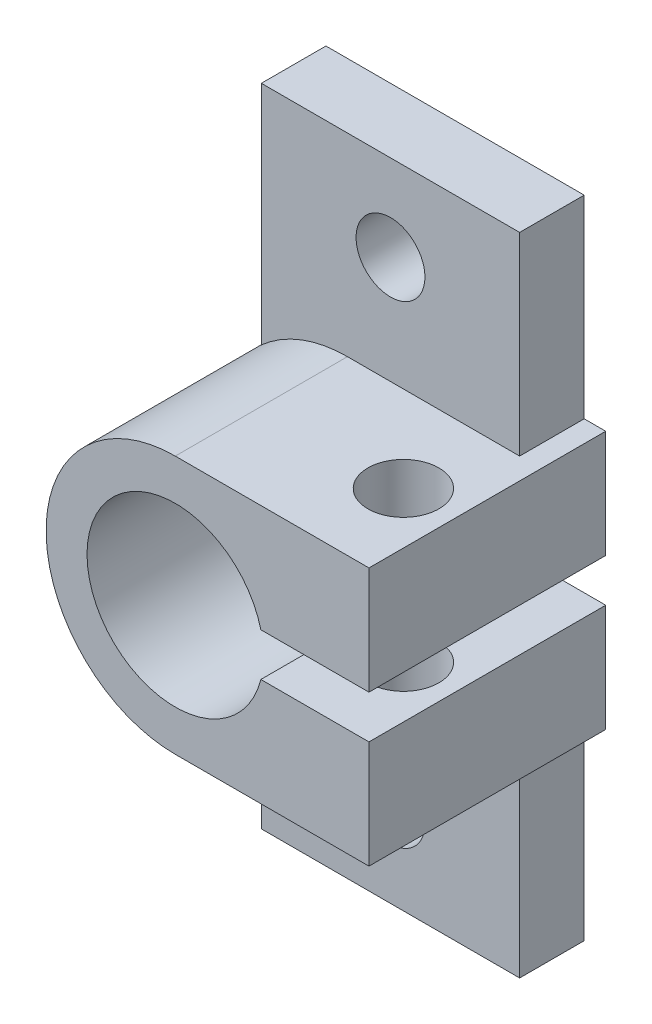
ISO-10303-21;
HEADER;
FILE_DESCRIPTION(('STEP AP214'),'2;1');
FILE_NAME('part.step','',(''),(''),'','','');
FILE_SCHEMA(('AUTOMOTIVE_DESIGN { 1 0 10303 214 1 1 1 1 }'));
ENDSEC;
DATA;
#1=APPLICATION_CONTEXT('core data for automotive mechanical design processes');
#2=APPLICATION_PROTOCOL_DEFINITION('international standard','automotive_design',2000,#1);
#3=PRODUCT_CONTEXT('',#1,'mechanical');
#4=PRODUCT('Part','Part','',(#3));
#5=PRODUCT_RELATED_PRODUCT_CATEGORY('part','',(#4));
#6=PRODUCT_DEFINITION_FORMATION('','',#4);
#7=PRODUCT_DEFINITION_CONTEXT('part definition',#1,'design');
#8=PRODUCT_DEFINITION('design','',#6,#7);
#9=PRODUCT_DEFINITION_SHAPE('','',#8);
#10=(LENGTH_UNIT() NAMED_UNIT(*) SI_UNIT(.MILLI.,.METRE.));
#11=(NAMED_UNIT(*) PLANE_ANGLE_UNIT() SI_UNIT($,.RADIAN.));
#12=(NAMED_UNIT(*) SI_UNIT($,.STERADIAN.) SOLID_ANGLE_UNIT());
#13=UNCERTAINTY_MEASURE_WITH_UNIT(LENGTH_MEASURE(1.E-05),#10,'distance_accuracy_value','');
#14=(GEOMETRIC_REPRESENTATION_CONTEXT(3) GLOBAL_UNCERTAINTY_ASSIGNED_CONTEXT((#13)) GLOBAL_UNIT_ASSIGNED_CONTEXT((#10,
#11,#12)) REPRESENTATION_CONTEXT('',''));
#15=CARTESIAN_POINT('',(0.,0.,0.));
#16=DIRECTION('',(0.,0.,1.));
#17=DIRECTION('',(1.,0.,0.));
#18=AXIS2_PLACEMENT_3D('',#15,#16,#17);
#19=CARTESIAN_POINT('',(0.,0.,0.));
#20=DIRECTION('',(0.,0.,1.));
#21=DIRECTION('',(1.,0.,0.));
#22=AXIS2_PLACEMENT_3D('',#19,#20,#21);
#23=CYLINDRICAL_SURFACE('',#22,6.);
#24=CARTESIAN_POINT('',(0.,0.,3.));
#25=DIRECTION('',(0.,0.,1.));
#26=DIRECTION('',(1.,0.,0.));
#27=AXIS2_PLACEMENT_3D('',#24,#25,#26);
#28=CIRCLE('',#27,6.);
#29=CARTESIAN_POINT('',(-4.,4.47213595499958,3.));
#30=VERTEX_POINT('',#29);
#31=CARTESIAN_POINT('',(0.,6.,3.));
#32=VERTEX_POINT('',#31);
#33=EDGE_CURVE('E47',#30,#32,#28,.F.);
#34=ORIENTED_EDGE('',*,*,#33,.F.);
#35=DIRECTION('',(0.,0.,1.));
#36=VECTOR('',#35,1.);
#37=CARTESIAN_POINT('',(-4.,4.47213595499958,0.));
#38=LINE('',#37,#36);
#39=CARTESIAN_POINT('',(-4.,4.47213595499958,0.));
#40=VERTEX_POINT('',#39);
#41=EDGE_CURVE('E11',#30,#40,#38,.F.);
#42=ORIENTED_EDGE('',*,*,#41,.T.);
#43=CARTESIAN_POINT('',(0.,0.,0.));
#44=DIRECTION('',(0.,0.,1.));
#45=DIRECTION('',(-1.,0.,0.));
#46=AXIS2_PLACEMENT_3D('',#43,#44,#45);
#47=CIRCLE('',#46,6.);
#48=CARTESIAN_POINT('',(-4.,-4.47213595499958,0.));
#49=VERTEX_POINT('',#48);
#50=EDGE_CURVE('E211',#40,#49,#47,.T.);
#51=ORIENTED_EDGE('',*,*,#50,.T.);
#52=DIRECTION('',(0.,0.,1.));
#53=VECTOR('',#52,1.);
#54=CARTESIAN_POINT('',(-4.,-4.47213595499958,0.));
#55=LINE('',#54,#53);
#56=CARTESIAN_POINT('',(-4.,-4.47213595499958,3.));
#57=VERTEX_POINT('',#56);
#58=EDGE_CURVE('E248',#57,#49,#55,.F.);
#59=ORIENTED_EDGE('',*,*,#58,.F.);
#60=CARTESIAN_POINT('',(0.,0.,3.));
#61=DIRECTION('',(0.,0.,1.));
#62=DIRECTION('',(1.,0.,0.));
#63=AXIS2_PLACEMENT_3D('',#60,#61,#62);
#64=CIRCLE('',#63,6.);
#65=CARTESIAN_POINT('',(0.,-6.,3.));
#66=VERTEX_POINT('',#65);
#67=EDGE_CURVE('E245',#57,#66,#64,.T.);
#68=ORIENTED_EDGE('',*,*,#67,.T.);
#69=DIRECTION('',(0.,0.,1.));
#70=VECTOR('',#69,1.);
#71=CARTESIAN_POINT('',(0.,-6.,0.));
#72=LINE('',#71,#70);
#73=CARTESIAN_POINT('',(0.,-6.,11.));
#74=VERTEX_POINT('',#73);
#75=EDGE_CURVE('E225',#66,#74,#72,.T.);
#76=ORIENTED_EDGE('',*,*,#75,.T.);
#77=CARTESIAN_POINT('',(0.,0.,11.));
#78=DIRECTION('',(0.,0.,1.));
#79=DIRECTION('',(-1.,0.,0.));
#80=AXIS2_PLACEMENT_3D('',#77,#78,#79);
#81=CIRCLE('',#80,6.);
#82=CARTESIAN_POINT('',(0.,6.,11.));
#83=VERTEX_POINT('',#82);
#84=EDGE_CURVE('E187',#83,#74,#81,.T.);
#85=ORIENTED_EDGE('',*,*,#84,.F.);
#86=DIRECTION('',(0.,0.,1.));
#87=VECTOR('',#86,1.);
#88=CARTESIAN_POINT('',(0.,6.,0.));
#89=LINE('',#88,#87);
#90=EDGE_CURVE('E226',#32,#83,#89,.T.);
#91=ORIENTED_EDGE('',*,*,#90,.F.);
#92=EDGE_LOOP('',(#34,#42,#51,#59,#68,#76,#85,#91));
#93=FACE_BOUND('',#92,.T.);
#94=ADVANCED_FACE('F32',(#93),#23,.T.);
#95=CARTESIAN_POINT('',(9.,6.,0.));
#96=DIRECTION('',(0.,1.,0.));
#97=DIRECTION('',(-1.,0.,0.));
#98=AXIS2_PLACEMENT_3D('',#95,#96,#97);
#99=PLANE('',#98);
#100=CARTESIAN_POINT('',(6.6,6.,7.));
#101=DIRECTION('',(0.,1.,0.));
#102=DIRECTION('',(-1.,0.,0.));
#103=AXIS2_PLACEMENT_3D('',#100,#101,#102);
#104=CIRCLE('',#103,1.65);
#105=CARTESIAN_POINT('',(4.95,6.,7.));
#106=VERTEX_POINT('',#105);
#107=EDGE_CURVE('E175',#106,#106,#104,.T.);
#108=ORIENTED_EDGE('',*,*,#107,.F.);
#109=EDGE_LOOP('',(#108));
#110=FACE_BOUND('',#109,.T.);
#111=DIRECTION('',(-1.,0.,0.));
#112=VECTOR('',#111,1.);
#113=CARTESIAN_POINT('',(9.,6.,0.));
#114=LINE('',#113,#112);
#115=CARTESIAN_POINT('',(9.,6.,0.));
#116=VERTEX_POINT('',#115);
#117=CARTESIAN_POINT('',(8.,6.,0.));
#118=VERTEX_POINT('',#117);
#119=EDGE_CURVE('E223',#116,#118,#114,.T.);
#120=ORIENTED_EDGE('',*,*,#119,.T.);
#121=DIRECTION('',(0.,0.,1.));
#122=VECTOR('',#121,1.);
#123=CARTESIAN_POINT('',(8.,6.,0.));
#124=LINE('',#123,#122);
#125=CARTESIAN_POINT('',(8.,6.,3.));
#126=VERTEX_POINT('',#125);
#127=EDGE_CURVE('E185',#118,#126,#124,.T.);
#128=ORIENTED_EDGE('',*,*,#127,.T.);
#129=DIRECTION('',(1.,0.,0.));
#130=VECTOR('',#129,1.);
#131=CARTESIAN_POINT('',(9.,6.,3.));
#132=LINE('',#131,#130);
#133=EDGE_CURVE('E150',#32,#126,#132,.T.);
#134=ORIENTED_EDGE('',*,*,#133,.F.);
#135=ORIENTED_EDGE('',*,*,#90,.T.);
#136=DIRECTION('',(-1.,0.,0.));
#137=VECTOR('',#136,1.);
#138=CARTESIAN_POINT('',(9.,6.,11.));
#139=LINE('',#138,#137);
#140=CARTESIAN_POINT('',(9.,6.,11.));
#141=VERTEX_POINT('',#140);
#142=EDGE_CURVE('E208',#141,#83,#139,.T.);
#143=ORIENTED_EDGE('',*,*,#142,.F.);
#144=DIRECTION('',(0.,0.,1.));
#145=VECTOR('',#144,1.);
#146=CARTESIAN_POINT('',(9.,6.,0.));
#147=LINE('',#146,#145);
#148=EDGE_CURVE('E229',#116,#141,#147,.T.);
#149=ORIENTED_EDGE('',*,*,#148,.F.);
#150=EDGE_LOOP('',(#120,#128,#134,#135,#143,#149));
#151=FACE_BOUND('',#150,.T.);
#152=ADVANCED_FACE('F316',(#110,#151),#99,.T.);
#153=CARTESIAN_POINT('',(0.,0.,3.));
#154=DIRECTION('',(0.,0.,-1.));
#155=DIRECTION('',(-1.,0.,0.));
#156=AXIS2_PLACEMENT_3D('',#153,#154,#155);
#157=CYLINDRICAL_SURFACE('',#156,4.1);
#158=DIRECTION('',(0.,0.,-1.));
#159=VECTOR('',#158,1.);
#160=CARTESIAN_POINT('',(3.97617907041421,-1.,3.));
#161=LINE('',#160,#159);
#162=CARTESIAN_POINT('',(3.97617907041421,-1.,11.));
#163=VERTEX_POINT('',#162);
#164=CARTESIAN_POINT('',(3.97617907041421,-1.,0.));
#165=VERTEX_POINT('',#164);
#166=EDGE_CURVE('E263',#163,#165,#161,.T.);
#167=ORIENTED_EDGE('',*,*,#166,.T.);
#168=CARTESIAN_POINT('',(0.,0.,0.));
#169=DIRECTION('',(0.,0.,1.));
#170=DIRECTION('',(1.,0.,0.));
#171=AXIS2_PLACEMENT_3D('',#168,#169,#170);
#172=CIRCLE('',#171,4.1);
#173=CARTESIAN_POINT('',(3.97617907041421,1.,0.));
#174=VERTEX_POINT('',#173);
#175=EDGE_CURVE('E251',#174,#165,#172,.T.);
#176=ORIENTED_EDGE('',*,*,#175,.F.);
#177=DIRECTION('',(0.,0.,1.));
#178=VECTOR('',#177,1.);
#179=CARTESIAN_POINT('',(3.97617907041421,1.,0.));
#180=LINE('',#179,#178);
#181=CARTESIAN_POINT('',(3.97617907041421,1.,11.));
#182=VERTEX_POINT('',#181);
#183=EDGE_CURVE('E233',#174,#182,#180,.T.);
#184=ORIENTED_EDGE('',*,*,#183,.T.);
#185=CARTESIAN_POINT('',(0.,0.,11.));
#186=DIRECTION('',(0.,0.,-1.));
#187=DIRECTION('',(1.,0.,0.));
#188=AXIS2_PLACEMENT_3D('',#185,#186,#187);
#189=CIRCLE('',#188,4.1);
#190=EDGE_CURVE('E199',#163,#182,#189,.T.);
#191=ORIENTED_EDGE('',*,*,#190,.F.);
#192=EDGE_LOOP('',(#167,#176,#184,#191));
#193=FACE_BOUND('',#192,.T.);
#194=ADVANCED_FACE('F34',(#193),#157,.F.);
#195=CARTESIAN_POINT('',(-4.,0.,3.));
#196=DIRECTION('',(1.,0.,0.));
#197=DIRECTION('',(0.,0.,-1.));
#198=AXIS2_PLACEMENT_3D('',#195,#196,#197);
#199=PLANE('',#198);
#200=DIRECTION('',(0.,-1.,0.));
#201=VECTOR('',#200,1.);
#202=CARTESIAN_POINT('',(-4.,0.,3.));
#203=LINE('',#202,#201);
#204=CARTESIAN_POINT('',(-4.,-15.,3.));
#205=VERTEX_POINT('',#204);
#206=EDGE_CURVE('E252',#57,#205,#203,.T.);
#207=ORIENTED_EDGE('',*,*,#206,.F.);
#208=ORIENTED_EDGE('',*,*,#58,.T.);
#209=DIRECTION('',(0.,-1.,0.));
#210=VECTOR('',#209,1.);
#211=CARTESIAN_POINT('',(-4.,0.,0.));
#212=LINE('',#211,#210);
#213=CARTESIAN_POINT('',(-4.,-15.,0.));
#214=VERTEX_POINT('',#213);
#215=EDGE_CURVE('E265',#49,#214,#212,.T.);
#216=ORIENTED_EDGE('',*,*,#215,.T.);
#217=DIRECTION('',(0.,0.,-1.));
#218=VECTOR('',#217,1.);
#219=CARTESIAN_POINT('',(-4.,-15.,3.));
#220=LINE('',#219,#218);
#221=EDGE_CURVE('E41',#205,#214,#220,.T.);
#222=ORIENTED_EDGE('',*,*,#221,.F.);
#223=EDGE_LOOP('',(#207,#208,#216,#222));
#224=FACE_BOUND('',#223,.T.);
#225=ADVANCED_FACE('F309',(#224),#199,.F.);
#226=CARTESIAN_POINT('',(0.,-15.,3.));
#227=DIRECTION('',(0.,-1.,0.));
#228=DIRECTION('',(1.,0.,0.));
#229=AXIS2_PLACEMENT_3D('',#226,#227,#228);
#230=PLANE('',#229);
#231=DIRECTION('',(-1.,0.,0.));
#232=VECTOR('',#231,1.);
#233=CARTESIAN_POINT('',(0.,-15.,0.));
#234=LINE('',#233,#232);
#235=CARTESIAN_POINT('',(8.,-15.,0.));
#236=VERTEX_POINT('',#235);
#237=EDGE_CURVE('E267',#236,#214,#234,.T.);
#238=ORIENTED_EDGE('',*,*,#237,.F.);
#239=DIRECTION('',(0.,0.,-1.));
#240=VECTOR('',#239,1.);
#241=CARTESIAN_POINT('',(8.,-15.,3.));
#242=LINE('',#241,#240);
#243=CARTESIAN_POINT('',(8.,-15.,3.));
#244=VERTEX_POINT('',#243);
#245=EDGE_CURVE('E278',#244,#236,#242,.T.);
#246=ORIENTED_EDGE('',*,*,#245,.F.);
#247=DIRECTION('',(-1.,0.,0.));
#248=VECTOR('',#247,1.);
#249=CARTESIAN_POINT('',(0.,-15.,3.));
#250=LINE('',#249,#248);
#251=EDGE_CURVE('E254',#244,#205,#250,.T.);
#252=ORIENTED_EDGE('',*,*,#251,.T.);
#253=ORIENTED_EDGE('',*,*,#221,.T.);
#254=EDGE_LOOP('',(#238,#246,#252,#253));
#255=FACE_BOUND('',#254,.T.);
#256=ADVANCED_FACE('F284',(#255),#230,.T.);
#257=CARTESIAN_POINT('',(8.,0.,3.));
#258=DIRECTION('',(-1.,0.,0.));
#259=DIRECTION('',(0.,-1.,0.));
#260=AXIS2_PLACEMENT_3D('',#257,#258,#259);
#261=PLANE('',#260);
#262=DIRECTION('',(0.,1.,0.));
#263=VECTOR('',#262,1.);
#264=CARTESIAN_POINT('',(8.,0.,0.));
#265=LINE('',#264,#263);
#266=CARTESIAN_POINT('',(8.,-6.,0.));
#267=VERTEX_POINT('',#266);
#268=EDGE_CURVE('E270',#236,#267,#265,.T.);
#269=ORIENTED_EDGE('',*,*,#268,.T.);
#270=DIRECTION('',(0.,0.,1.));
#271=VECTOR('',#270,1.);
#272=CARTESIAN_POINT('',(8.,-6.,3.));
#273=LINE('',#272,#271);
#274=CARTESIAN_POINT('',(8.,-6.,3.));
#275=VERTEX_POINT('',#274);
#276=EDGE_CURVE('E242',#267,#275,#273,.T.);
#277=ORIENTED_EDGE('',*,*,#276,.T.);
#278=DIRECTION('',(0.,1.,0.));
#279=VECTOR('',#278,1.);
#280=CARTESIAN_POINT('',(8.,0.,3.));
#281=LINE('',#280,#279);
#282=EDGE_CURVE('E258',#244,#275,#281,.T.);
#283=ORIENTED_EDGE('',*,*,#282,.F.);
#284=ORIENTED_EDGE('',*,*,#245,.T.);
#285=EDGE_LOOP('',(#269,#277,#283,#284));
#286=FACE_BOUND('',#285,.T.);
#287=ADVANCED_FACE('F297',(#286),#261,.F.);
#288=CARTESIAN_POINT('',(0.,-1.,3.));
#289=DIRECTION('',(0.,1.,0.));
#290=DIRECTION('',(0.,0.,1.));
#291=AXIS2_PLACEMENT_3D('',#288,#289,#290);
#292=PLANE('',#291);
#293=CARTESIAN_POINT('',(6.6,-1.,7.));
#294=DIRECTION('',(0.,1.,0.));
#295=DIRECTION('',(0.,0.,1.));
#296=AXIS2_PLACEMENT_3D('',#293,#294,#295);
#297=CIRCLE('',#296,1.65);
#298=CARTESIAN_POINT('',(6.6,-1.,8.65));
#299=VERTEX_POINT('',#298);
#300=EDGE_CURVE('E523',#299,#299,#297,.T.);
#301=ORIENTED_EDGE('',*,*,#300,.F.);
#302=EDGE_LOOP('',(#301));
#303=FACE_BOUND('',#302,.T.);
#304=DIRECTION('',(0.,0.,1.));
#305=VECTOR('',#304,1.);
#306=CARTESIAN_POINT('',(9.,-1.,0.));
#307=LINE('',#306,#305);
#308=CARTESIAN_POINT('',(9.,-1.,0.));
#309=VERTEX_POINT('',#308);
#310=CARTESIAN_POINT('',(9.,-1.,11.));
#311=VERTEX_POINT('',#310);
#312=EDGE_CURVE('E235',#309,#311,#307,.T.);
#313=ORIENTED_EDGE('',*,*,#312,.F.);
#314=DIRECTION('',(1.,0.,0.));
#315=VECTOR('',#314,1.);
#316=CARTESIAN_POINT('',(0.,-1.,0.));
#317=LINE('',#316,#315);
#318=EDGE_CURVE('E272',#165,#309,#317,.T.);
#319=ORIENTED_EDGE('',*,*,#318,.F.);
#320=ORIENTED_EDGE('',*,*,#166,.F.);
#321=DIRECTION('',(-1.,0.,0.));
#322=VECTOR('',#321,1.);
#323=CARTESIAN_POINT('',(9.,-1.,11.));
#324=LINE('',#323,#322);
#325=EDGE_CURVE('E196',#311,#163,#324,.T.);
#326=ORIENTED_EDGE('',*,*,#325,.F.);
#327=EDGE_LOOP('',(#313,#319,#320,#326));
#328=FACE_BOUND('',#327,.T.);
#329=ADVANCED_FACE('F335',(#303,#328),#292,.T.);
#330=CARTESIAN_POINT('',(2.,-11.,3.));
#331=DIRECTION('',(0.,0.,-1.));
#332=DIRECTION('',(-1.,0.,0.));
#333=AXIS2_PLACEMENT_3D('',#330,#331,#332);
#334=CYLINDRICAL_SURFACE('',#333,1.6);
#335=CARTESIAN_POINT('',(2.,-11.,3.));
#336=DIRECTION('',(0.,0.,1.));
#337=DIRECTION('',(1.,0.,0.));
#338=AXIS2_PLACEMENT_3D('',#335,#336,#337);
#339=CIRCLE('',#338,1.6);
#340=CARTESIAN_POINT('',(3.6,-11.,3.));
#341=VERTEX_POINT('',#340);
#342=EDGE_CURVE('E260',#341,#341,#339,.T.);
#343=ORIENTED_EDGE('',*,*,#342,.T.);
#344=EDGE_LOOP('',(#343));
#345=FACE_BOUND('',#344,.T.);
#346=CARTESIAN_POINT('',(2.,-11.,0.));
#347=DIRECTION('',(0.,0.,1.));
#348=DIRECTION('',(1.,0.,0.));
#349=AXIS2_PLACEMENT_3D('',#346,#347,#348);
#350=CIRCLE('',#349,1.6);
#351=CARTESIAN_POINT('',(3.6,-11.,0.));
#352=VERTEX_POINT('',#351);
#353=EDGE_CURVE('E255',#352,#352,#350,.T.);
#354=ORIENTED_EDGE('',*,*,#353,.F.);
#355=EDGE_LOOP('',(#354));
#356=FACE_BOUND('',#355,.T.);
#357=ADVANCED_FACE('F330',(#345,#356),#334,.F.);
#358=CARTESIAN_POINT('',(0.,0.,3.));
#359=DIRECTION('',(0.,0.,1.));
#360=DIRECTION('',(1.,0.,0.));
#361=AXIS2_PLACEMENT_3D('',#358,#359,#360);
#362=PLANE('',#361);
#363=ORIENTED_EDGE('',*,*,#67,.F.);
#364=ORIENTED_EDGE('',*,*,#206,.T.);
#365=ORIENTED_EDGE('',*,*,#251,.F.);
#366=ORIENTED_EDGE('',*,*,#282,.T.);
#367=DIRECTION('',(1.,0.,0.));
#368=VECTOR('',#367,1.);
#369=CARTESIAN_POINT('',(0.,-6.,3.));
#370=LINE('',#369,#368);
#371=EDGE_CURVE('E228',#66,#275,#370,.T.);
#372=ORIENTED_EDGE('',*,*,#371,.F.);
#373=EDGE_LOOP('',(#363,#364,#365,#366,#372));
#374=FACE_BOUND('',#373,.T.);
#375=ORIENTED_EDGE('',*,*,#342,.F.);
#376=EDGE_LOOP('',(#375));
#377=FACE_BOUND('',#376,.T.);
#378=ADVANCED_FACE('F305',(#374,#377),#362,.T.);
#379=CARTESIAN_POINT('',(0.,0.,0.));
#380=DIRECTION('',(0.,0.,1.));
#381=DIRECTION('',(1.,0.,0.));
#382=AXIS2_PLACEMENT_3D('',#379,#380,#381);
#383=PLANE('',#382);
#384=ORIENTED_EDGE('',*,*,#175,.T.);
#385=ORIENTED_EDGE('',*,*,#318,.T.);
#386=DIRECTION('',(0.,1.,0.));
#387=VECTOR('',#386,1.);
#388=CARTESIAN_POINT('',(9.,-1.,0.));
#389=LINE('',#388,#387);
#390=CARTESIAN_POINT('',(9.,-6.,0.));
#391=VERTEX_POINT('',#390);
#392=EDGE_CURVE('E215',#391,#309,#389,.T.);
#393=ORIENTED_EDGE('',*,*,#392,.F.);
#394=DIRECTION('',(1.,0.,0.));
#395=VECTOR('',#394,1.);
#396=CARTESIAN_POINT('',(9.,-6.,0.));
#397=LINE('',#396,#395);
#398=EDGE_CURVE('E213',#267,#391,#397,.T.);
#399=ORIENTED_EDGE('',*,*,#398,.F.);
#400=ORIENTED_EDGE('',*,*,#268,.F.);
#401=ORIENTED_EDGE('',*,*,#237,.T.);
#402=ORIENTED_EDGE('',*,*,#215,.F.);
#403=ORIENTED_EDGE('',*,*,#50,.F.);
#404=DIRECTION('',(0.,-1.,0.));
#405=VECTOR('',#404,1.);
#406=CARTESIAN_POINT('',(-4.,0.,0.));
#407=LINE('',#406,#405);
#408=CARTESIAN_POINT('',(-4.,15.,0.));
#409=VERTEX_POINT('',#408);
#410=EDGE_CURVE('E179',#409,#40,#407,.T.);
#411=ORIENTED_EDGE('',*,*,#410,.F.);
#412=DIRECTION('',(1.,0.,0.));
#413=VECTOR('',#412,1.);
#414=CARTESIAN_POINT('',(0.,15.,0.));
#415=LINE('',#414,#413);
#416=CARTESIAN_POINT('',(8.,15.,0.));
#417=VERTEX_POINT('',#416);
#418=EDGE_CURVE('E177',#409,#417,#415,.T.);
#419=ORIENTED_EDGE('',*,*,#418,.T.);
#420=DIRECTION('',(0.,1.,0.));
#421=VECTOR('',#420,1.);
#422=CARTESIAN_POINT('',(8.,0.,0.));
#423=LINE('',#422,#421);
#424=EDGE_CURVE('E159',#118,#417,#423,.T.);
#425=ORIENTED_EDGE('',*,*,#424,.F.);
#426=ORIENTED_EDGE('',*,*,#119,.F.);
#427=DIRECTION('',(0.,1.,0.));
#428=VECTOR('',#427,1.);
#429=CARTESIAN_POINT('',(9.,6.,0.));
#430=LINE('',#429,#428);
#431=CARTESIAN_POINT('',(9.,1.,0.));
#432=VERTEX_POINT('',#431);
#433=EDGE_CURVE('E220',#432,#116,#430,.T.);
#434=ORIENTED_EDGE('',*,*,#433,.F.);
#435=DIRECTION('',(1.,0.,0.));
#436=VECTOR('',#435,1.);
#437=CARTESIAN_POINT('',(3.97617907041421,1.,0.));
#438=LINE('',#437,#436);
#439=EDGE_CURVE('E218',#174,#432,#438,.T.);
#440=ORIENTED_EDGE('',*,*,#439,.F.);
#441=EDGE_LOOP('',(#384,#385,#393,#399,#400,#401,#402,#403,#411,#419,#425,#426,#434,#440));
#442=FACE_BOUND('',#441,.T.);
#443=CARTESIAN_POINT('',(2.,11.,0.));
#444=DIRECTION('',(0.,0.,1.));
#445=DIRECTION('',(1.,0.,0.));
#446=AXIS2_PLACEMENT_3D('',#443,#444,#445);
#447=CIRCLE('',#446,1.6);
#448=CARTESIAN_POINT('',(3.6,11.,0.));
#449=VERTEX_POINT('',#448);
#450=EDGE_CURVE('E172',#449,#449,#447,.T.);
#451=ORIENTED_EDGE('',*,*,#450,.T.);
#452=EDGE_LOOP('',(#451));
#453=FACE_BOUND('',#452,.T.);
#454=ORIENTED_EDGE('',*,*,#353,.T.);
#455=EDGE_LOOP('',(#454));
#456=FACE_BOUND('',#455,.T.);
#457=ADVANCED_FACE('F291',(#442,#453,#456),#383,.F.);
#458=CARTESIAN_POINT('',(9.,-6.,0.));
#459=DIRECTION('',(0.,-1.,0.));
#460=DIRECTION('',(1.,0.,0.));
#461=AXIS2_PLACEMENT_3D('',#458,#459,#460);
#462=PLANE('',#461);
#463=CARTESIAN_POINT('',(6.6,-6.,7.));
#464=DIRECTION('',(0.,-1.,0.));
#465=DIRECTION('',(1.,0.,0.));
#466=AXIS2_PLACEMENT_3D('',#463,#464,#465);
#467=CIRCLE('',#466,1.65);
#468=CARTESIAN_POINT('',(8.25,-6.,7.));
#469=VERTEX_POINT('',#468);
#470=EDGE_CURVE('E526',#469,#469,#467,.T.);
#471=ORIENTED_EDGE('',*,*,#470,.F.);
#472=EDGE_LOOP('',(#471));
#473=FACE_BOUND('',#472,.T.);
#474=ORIENTED_EDGE('',*,*,#276,.F.);
#475=ORIENTED_EDGE('',*,*,#398,.T.);
#476=DIRECTION('',(0.,0.,1.));
#477=VECTOR('',#476,1.);
#478=CARTESIAN_POINT('',(9.,-6.,0.));
#479=LINE('',#478,#477);
#480=CARTESIAN_POINT('',(9.,-6.,11.));
#481=VERTEX_POINT('',#480);
#482=EDGE_CURVE('E237',#391,#481,#479,.T.);
#483=ORIENTED_EDGE('',*,*,#482,.T.);
#484=DIRECTION('',(1.,0.,0.));
#485=VECTOR('',#484,1.);
#486=CARTESIAN_POINT('',(9.,-6.,11.));
#487=LINE('',#486,#485);
#488=EDGE_CURVE('E190',#74,#481,#487,.T.);
#489=ORIENTED_EDGE('',*,*,#488,.F.);
#490=ORIENTED_EDGE('',*,*,#75,.F.);
#491=ORIENTED_EDGE('',*,*,#371,.T.);
#492=EDGE_LOOP('',(#474,#475,#483,#489,#490,#491));
#493=FACE_BOUND('',#492,.T.);
#494=ADVANCED_FACE('F300',(#473,#493),#462,.T.);
#495=CARTESIAN_POINT('',(9.,6.,0.));
#496=DIRECTION('',(1.,0.,0.));
#497=DIRECTION('',(0.,0.,-1.));
#498=AXIS2_PLACEMENT_3D('',#495,#496,#497);
#499=PLANE('',#498);
#500=ORIENTED_EDGE('',*,*,#148,.T.);
#501=DIRECTION('',(0.,1.,0.));
#502=VECTOR('',#501,1.);
#503=CARTESIAN_POINT('',(9.,6.,11.));
#504=LINE('',#503,#502);
#505=CARTESIAN_POINT('',(9.,1.,11.));
#506=VERTEX_POINT('',#505);
#507=EDGE_CURVE('E205',#506,#141,#504,.T.);
#508=ORIENTED_EDGE('',*,*,#507,.F.);
#509=DIRECTION('',(0.,0.,1.));
#510=VECTOR('',#509,1.);
#511=CARTESIAN_POINT('',(9.,1.,0.));
#512=LINE('',#511,#510);
#513=EDGE_CURVE('E231',#432,#506,#512,.T.);
#514=ORIENTED_EDGE('',*,*,#513,.F.);
#515=ORIENTED_EDGE('',*,*,#433,.T.);
#516=EDGE_LOOP('',(#500,#508,#514,#515));
#517=FACE_BOUND('',#516,.T.);
#518=ADVANCED_FACE('F369',(#517),#499,.T.);
#519=CARTESIAN_POINT('',(3.97617907041421,1.,0.));
#520=DIRECTION('',(0.,-1.,0.));
#521=DIRECTION('',(0.,0.,-1.));
#522=AXIS2_PLACEMENT_3D('',#519,#520,#521);
#523=PLANE('',#522);
#524=CARTESIAN_POINT('',(6.6,0.999999999999999,7.));
#525=DIRECTION('',(0.,-1.,0.));
#526=DIRECTION('',(0.,0.,-1.));
#527=AXIS2_PLACEMENT_3D('',#524,#525,#526);
#528=CIRCLE('',#527,1.65);
#529=CARTESIAN_POINT('',(6.6,0.999999999999999,5.35));
#530=VERTEX_POINT('',#529);
#531=EDGE_CURVE('E36',#530,#530,#528,.T.);
#532=ORIENTED_EDGE('',*,*,#531,.F.);
#533=EDGE_LOOP('',(#532));
#534=FACE_BOUND('',#533,.T.);
#535=ORIENTED_EDGE('',*,*,#439,.T.);
#536=ORIENTED_EDGE('',*,*,#513,.T.);
#537=DIRECTION('',(1.,0.,0.));
#538=VECTOR('',#537,1.);
#539=CARTESIAN_POINT('',(3.97617907041421,1.,11.));
#540=LINE('',#539,#538);
#541=EDGE_CURVE('E202',#182,#506,#540,.T.);
#542=ORIENTED_EDGE('',*,*,#541,.F.);
#543=ORIENTED_EDGE('',*,*,#183,.F.);
#544=EDGE_LOOP('',(#535,#536,#542,#543));
#545=FACE_BOUND('',#544,.T.);
#546=ADVANCED_FACE('F376',(#534,#545),#523,.T.);
#547=CARTESIAN_POINT('',(9.,-1.,0.));
#548=DIRECTION('',(1.,0.,0.));
#549=DIRECTION('',(0.,0.,-1.));
#550=AXIS2_PLACEMENT_3D('',#547,#548,#549);
#551=PLANE('',#550);
#552=ORIENTED_EDGE('',*,*,#312,.T.);
#553=DIRECTION('',(0.,1.,0.));
#554=VECTOR('',#553,1.);
#555=CARTESIAN_POINT('',(9.,-1.,11.));
#556=LINE('',#555,#554);
#557=EDGE_CURVE('E193',#481,#311,#556,.T.);
#558=ORIENTED_EDGE('',*,*,#557,.F.);
#559=ORIENTED_EDGE('',*,*,#482,.F.);
#560=ORIENTED_EDGE('',*,*,#392,.T.);
#561=EDGE_LOOP('',(#552,#558,#559,#560));
#562=FACE_BOUND('',#561,.T.);
#563=ADVANCED_FACE('F384',(#562),#551,.T.);
#564=CARTESIAN_POINT('',(0.,0.,11.));
#565=DIRECTION('',(0.,0.,-1.));
#566=DIRECTION('',(-1.,0.,0.));
#567=AXIS2_PLACEMENT_3D('',#564,#565,#566);
#568=PLANE('',#567);
#569=ORIENTED_EDGE('',*,*,#84,.T.);
#570=ORIENTED_EDGE('',*,*,#488,.T.);
#571=ORIENTED_EDGE('',*,*,#557,.T.);
#572=ORIENTED_EDGE('',*,*,#325,.T.);
#573=ORIENTED_EDGE('',*,*,#190,.T.);
#574=ORIENTED_EDGE('',*,*,#541,.T.);
#575=ORIENTED_EDGE('',*,*,#507,.T.);
#576=ORIENTED_EDGE('',*,*,#142,.T.);
#577=EDGE_LOOP('',(#569,#570,#571,#572,#573,#574,#575,#576));
#578=FACE_BOUND('',#577,.T.);
#579=ADVANCED_FACE('F392',(#578),#568,.F.);
#580=CARTESIAN_POINT('',(8.,0.,3.));
#581=DIRECTION('',(-1.,0.,0.));
#582=DIRECTION('',(0.,-1.,0.));
#583=AXIS2_PLACEMENT_3D('',#580,#581,#582);
#584=PLANE('',#583);
#585=ORIENTED_EDGE('',*,*,#127,.F.);
#586=ORIENTED_EDGE('',*,*,#424,.T.);
#587=DIRECTION('',(0.,0.,-1.));
#588=VECTOR('',#587,1.);
#589=CARTESIAN_POINT('',(8.,15.,3.));
#590=LINE('',#589,#588);
#591=CARTESIAN_POINT('',(8.,15.,3.));
#592=VERTEX_POINT('',#591);
#593=EDGE_CURVE('E156',#592,#417,#590,.T.);
#594=ORIENTED_EDGE('',*,*,#593,.F.);
#595=DIRECTION('',(0.,1.,0.));
#596=VECTOR('',#595,1.);
#597=CARTESIAN_POINT('',(8.,0.,3.));
#598=LINE('',#597,#596);
#599=EDGE_CURVE('E144',#126,#592,#598,.T.);
#600=ORIENTED_EDGE('',*,*,#599,.F.);
#601=EDGE_LOOP('',(#585,#586,#594,#600));
#602=FACE_BOUND('',#601,.T.);
#603=ADVANCED_FACE('F157',(#602),#584,.F.);
#604=CARTESIAN_POINT('',(0.,15.,3.));
#605=DIRECTION('',(0.,1.,0.));
#606=DIRECTION('',(0.,0.,1.));
#607=AXIS2_PLACEMENT_3D('',#604,#605,#606);
#608=PLANE('',#607);
#609=ORIENTED_EDGE('',*,*,#418,.F.);
#610=DIRECTION('',(0.,0.,-1.));
#611=VECTOR('',#610,1.);
#612=CARTESIAN_POINT('',(-4.,15.,3.));
#613=LINE('',#612,#611);
#614=CARTESIAN_POINT('',(-4.,15.,3.));
#615=VERTEX_POINT('',#614);
#616=EDGE_CURVE('E163',#615,#409,#613,.T.);
#617=ORIENTED_EDGE('',*,*,#616,.F.);
#618=DIRECTION('',(1.,0.,0.));
#619=VECTOR('',#618,1.);
#620=CARTESIAN_POINT('',(0.,15.,3.));
#621=LINE('',#620,#619);
#622=EDGE_CURVE('E149',#615,#592,#621,.T.);
#623=ORIENTED_EDGE('',*,*,#622,.T.);
#624=ORIENTED_EDGE('',*,*,#593,.T.);
#625=EDGE_LOOP('',(#609,#617,#623,#624));
#626=FACE_BOUND('',#625,.T.);
#627=ADVANCED_FACE('F165',(#626),#608,.T.);
#628=CARTESIAN_POINT('',(2.,11.,3.));
#629=DIRECTION('',(0.,0.,-1.));
#630=DIRECTION('',(-1.,0.,0.));
#631=AXIS2_PLACEMENT_3D('',#628,#629,#630);
#632=CYLINDRICAL_SURFACE('',#631,1.6);
#633=CARTESIAN_POINT('',(2.,11.,3.));
#634=DIRECTION('',(0.,0.,1.));
#635=DIRECTION('',(1.,0.,0.));
#636=AXIS2_PLACEMENT_3D('',#633,#634,#635);
#637=CIRCLE('',#636,1.6);
#638=CARTESIAN_POINT('',(3.6,11.,3.));
#639=VERTEX_POINT('',#638);
#640=EDGE_CURVE('E153',#639,#639,#637,.T.);
#641=ORIENTED_EDGE('',*,*,#640,.T.);
#642=EDGE_LOOP('',(#641));
#643=FACE_BOUND('',#642,.T.);
#644=ORIENTED_EDGE('',*,*,#450,.F.);
#645=EDGE_LOOP('',(#644));
#646=FACE_BOUND('',#645,.T.);
#647=ADVANCED_FACE('F412',(#643,#646),#632,.F.);
#648=CARTESIAN_POINT('',(-4.,0.,3.));
#649=DIRECTION('',(1.,0.,0.));
#650=DIRECTION('',(0.,0.,-1.));
#651=AXIS2_PLACEMENT_3D('',#648,#649,#650);
#652=PLANE('',#651);
#653=ORIENTED_EDGE('',*,*,#41,.F.);
#654=DIRECTION('',(0.,-1.,0.));
#655=VECTOR('',#654,1.);
#656=CARTESIAN_POINT('',(-4.,0.,3.));
#657=LINE('',#656,#655);
#658=EDGE_CURVE('E167',#615,#30,#657,.T.);
#659=ORIENTED_EDGE('',*,*,#658,.F.);
#660=ORIENTED_EDGE('',*,*,#616,.T.);
#661=ORIENTED_EDGE('',*,*,#410,.T.);
#662=EDGE_LOOP('',(#653,#659,#660,#661));
#663=FACE_BOUND('',#662,.T.);
#664=ADVANCED_FACE('F419',(#663),#652,.F.);
#665=CARTESIAN_POINT('',(0.,0.,3.));
#666=DIRECTION('',(0.,0.,1.));
#667=DIRECTION('',(1.,0.,0.));
#668=AXIS2_PLACEMENT_3D('',#665,#666,#667);
#669=PLANE('',#668);
#670=ORIENTED_EDGE('',*,*,#640,.F.);
#671=EDGE_LOOP('',(#670));
#672=FACE_BOUND('',#671,.T.);
#673=ORIENTED_EDGE('',*,*,#658,.T.);
#674=ORIENTED_EDGE('',*,*,#33,.T.);
#675=ORIENTED_EDGE('',*,*,#133,.T.);
#676=ORIENTED_EDGE('',*,*,#599,.T.);
#677=ORIENTED_EDGE('',*,*,#622,.F.);
#678=EDGE_LOOP('',(#673,#674,#675,#676,#677));
#679=FACE_BOUND('',#678,.T.);
#680=ADVANCED_FACE('F147',(#672,#679),#669,.T.);
#681=CARTESIAN_POINT('',(6.6,15.,7.));
#682=DIRECTION('',(0.,-1.,0.));
#683=DIRECTION('',(1.,0.,0.));
#684=AXIS2_PLACEMENT_3D('',#681,#682,#683);
#685=CYLINDRICAL_SURFACE('',#684,1.65);
#686=ORIENTED_EDGE('',*,*,#107,.T.);
#687=EDGE_LOOP('',(#686));
#688=FACE_BOUND('',#687,.T.);
#689=ORIENTED_EDGE('',*,*,#531,.T.);
#690=EDGE_LOOP('',(#689));
#691=FACE_BOUND('',#690,.T.);
#692=ADVANCED_FACE('F434',(#688,#691),#685,.F.);
#693=ORIENTED_EDGE('',*,*,#300,.T.);
#694=EDGE_LOOP('',(#693));
#695=FACE_BOUND('',#694,.T.);
#696=ORIENTED_EDGE('',*,*,#470,.T.);
#697=EDGE_LOOP('',(#696));
#698=FACE_BOUND('',#697,.T.);
#699=ADVANCED_FACE('F441',(#695,#698),#685,.F.);
#700=CLOSED_SHELL('',(#94,#152,#194,#225,#256,#287,#329,#357,#378,#457,#494,#518,#546,#563,#579,
#603,#627,#647,#664,#680,#692,#699));
#701=MANIFOLD_SOLID_BREP('B2',#700);
#702=ADVANCED_BREP_SHAPE_REPRESENTATION('',(#18,#701),#14);
#703=SHAPE_DEFINITION_REPRESENTATION(#9,#702);
ENDSEC;
END-ISO-10303-21;
